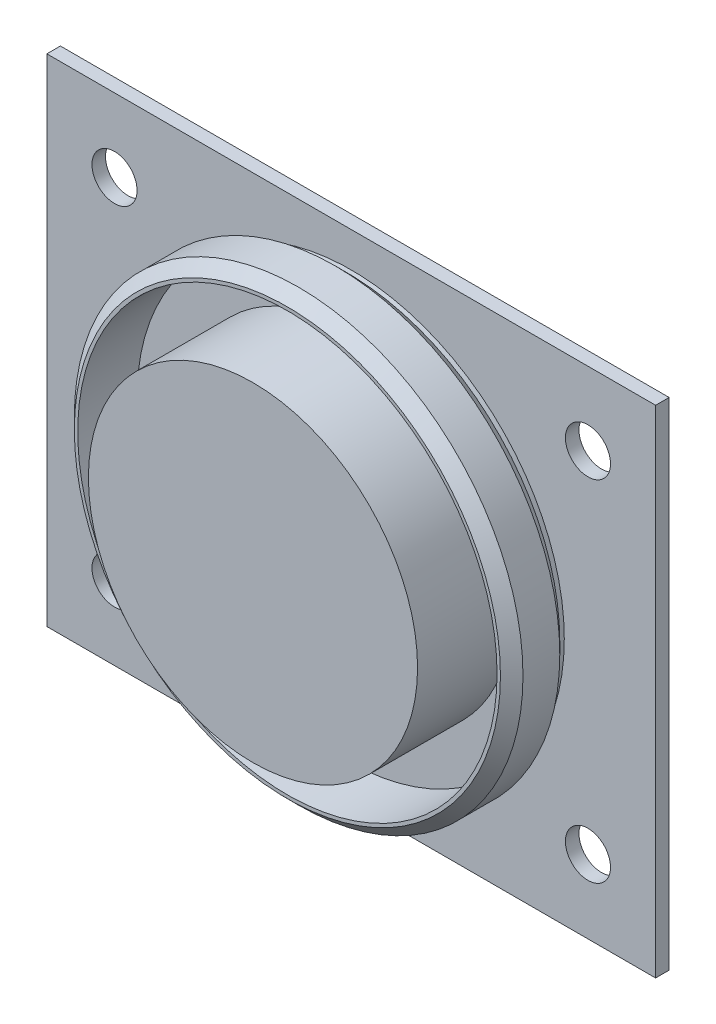
ISO-10303-21;
HEADER;
FILE_DESCRIPTION(('STEP AP214'),'2;1');
FILE_NAME('part.step','',(''),(''),'','','');
FILE_SCHEMA(('AUTOMOTIVE_DESIGN { 1 0 10303 214 1 1 1 1 }'));
ENDSEC;
DATA;
#1=APPLICATION_CONTEXT('core data for automotive mechanical design processes');
#2=APPLICATION_PROTOCOL_DEFINITION('international standard','automotive_design',2000,#1);
#3=PRODUCT_CONTEXT('',#1,'mechanical');
#4=PRODUCT('Part','Part','',(#3));
#5=PRODUCT_RELATED_PRODUCT_CATEGORY('part','',(#4));
#6=PRODUCT_DEFINITION_FORMATION('','',#4);
#7=PRODUCT_DEFINITION_CONTEXT('part definition',#1,'design');
#8=PRODUCT_DEFINITION('design','',#6,#7);
#9=PRODUCT_DEFINITION_SHAPE('','',#8);
#10=(LENGTH_UNIT() NAMED_UNIT(*) SI_UNIT(.MILLI.,.METRE.));
#11=(NAMED_UNIT(*) PLANE_ANGLE_UNIT() SI_UNIT($,.RADIAN.));
#12=(NAMED_UNIT(*) SI_UNIT($,.STERADIAN.) SOLID_ANGLE_UNIT());
#13=UNCERTAINTY_MEASURE_WITH_UNIT(LENGTH_MEASURE(1.E-05),#10,'distance_accuracy_value','');
#14=(GEOMETRIC_REPRESENTATION_CONTEXT(3) GLOBAL_UNCERTAINTY_ASSIGNED_CONTEXT((#13)) GLOBAL_UNIT_ASSIGNED_CONTEXT((#10,
#11,#12)) REPRESENTATION_CONTEXT('',''));
#15=CARTESIAN_POINT('',(0.,0.,0.));
#16=DIRECTION('',(0.,0.,1.));
#17=DIRECTION('',(1.,0.,0.));
#18=AXIS2_PLACEMENT_3D('',#15,#16,#17);
#19=CARTESIAN_POINT('',(0.,0.,3.));
#20=DIRECTION('',(0.,0.,1.));
#21=DIRECTION('',(1.,0.,0.));
#22=AXIS2_PLACEMENT_3D('',#19,#20,#21);
#23=PLANE('',#22);
#24=CARTESIAN_POINT('',(0.,0.,3.));
#25=DIRECTION('',(0.,0.,1.));
#26=DIRECTION('',(1.,0.,0.));
#27=AXIS2_PLACEMENT_3D('',#24,#25,#26);
#28=CIRCLE('',#27,47.25);
#29=CARTESIAN_POINT('',(47.25,0.,3.));
#30=VERTEX_POINT('',#29);
#31=EDGE_CURVE('E11',#30,#30,#28,.T.);
#32=ORIENTED_EDGE('',*,*,#31,.F.);
#33=EDGE_LOOP('',(#32));
#34=FACE_BOUND('',#33,.T.);
#35=CARTESIAN_POINT('',(52.5,-38.75,3.));
#36=DIRECTION('',(0.,0.,1.));
#37=DIRECTION('',(1.,0.,0.));
#38=AXIS2_PLACEMENT_3D('',#35,#36,#37);
#39=CIRCLE('',#38,5.00000000000001);
#40=CARTESIAN_POINT('',(57.5,-38.75,3.));
#41=VERTEX_POINT('',#40);
#42=EDGE_CURVE('E142',#41,#41,#39,.T.);
#43=ORIENTED_EDGE('',*,*,#42,.F.);
#44=EDGE_LOOP('',(#43));
#45=FACE_BOUND('',#44,.T.);
#46=CARTESIAN_POINT('',(-52.5,-38.75,3.));
#47=DIRECTION('',(0.,0.,1.));
#48=DIRECTION('',(1.,0.,0.));
#49=AXIS2_PLACEMENT_3D('',#46,#47,#48);
#50=CIRCLE('',#49,5.);
#51=CARTESIAN_POINT('',(-47.5,-38.75,3.));
#52=VERTEX_POINT('',#51);
#53=EDGE_CURVE('E105',#52,#52,#50,.T.);
#54=ORIENTED_EDGE('',*,*,#53,.F.);
#55=EDGE_LOOP('',(#54));
#56=FACE_BOUND('',#55,.T.);
#57=DIRECTION('',(0.,1.,0.));
#58=VECTOR('',#57,1.);
#59=CARTESIAN_POINT('',(67.5,55.,3.));
#60=LINE('',#59,#58);
#61=CARTESIAN_POINT('',(67.5,-55.,3.));
#62=VERTEX_POINT('',#61);
#63=CARTESIAN_POINT('',(67.5,55.,3.));
#64=VERTEX_POINT('',#63);
#65=EDGE_CURVE('E88',#62,#64,#60,.T.);
#66=ORIENTED_EDGE('',*,*,#65,.T.);
#67=DIRECTION('',(-1.,0.,0.));
#68=VECTOR('',#67,1.);
#69=CARTESIAN_POINT('',(-67.5,55.,3.));
#70=LINE('',#69,#68);
#71=CARTESIAN_POINT('',(-67.5,55.,3.));
#72=VERTEX_POINT('',#71);
#73=EDGE_CURVE('E83',#64,#72,#70,.T.);
#74=ORIENTED_EDGE('',*,*,#73,.T.);
#75=DIRECTION('',(0.,-1.,0.));
#76=VECTOR('',#75,1.);
#77=CARTESIAN_POINT('',(-67.5,55.,3.));
#78=LINE('',#77,#76);
#79=CARTESIAN_POINT('',(-67.5,-55.,3.));
#80=VERTEX_POINT('',#79);
#81=EDGE_CURVE('E86',#72,#80,#78,.T.);
#82=ORIENTED_EDGE('',*,*,#81,.T.);
#83=DIRECTION('',(1.,0.,0.));
#84=VECTOR('',#83,1.);
#85=CARTESIAN_POINT('',(-67.5,-55.,3.));
#86=LINE('',#85,#84);
#87=EDGE_CURVE('E52',#80,#62,#86,.T.);
#88=ORIENTED_EDGE('',*,*,#87,.T.);
#89=EDGE_LOOP('',(#66,#74,#82,#88));
#90=FACE_BOUND('',#89,.T.);
#91=CARTESIAN_POINT('',(-52.5,38.75,3.));
#92=DIRECTION('',(0.,0.,1.));
#93=DIRECTION('',(1.,0.,0.));
#94=AXIS2_PLACEMENT_3D('',#91,#92,#93);
#95=CIRCLE('',#94,5.);
#96=CARTESIAN_POINT('',(-47.5,38.75,3.));
#97=VERTEX_POINT('',#96);
#98=EDGE_CURVE('E146',#97,#97,#95,.T.);
#99=ORIENTED_EDGE('',*,*,#98,.F.);
#100=EDGE_LOOP('',(#99));
#101=FACE_BOUND('',#100,.T.);
#102=CARTESIAN_POINT('',(52.5,38.75,3.));
#103=DIRECTION('',(0.,0.,1.));
#104=DIRECTION('',(1.,0.,0.));
#105=AXIS2_PLACEMENT_3D('',#102,#103,#104);
#106=CIRCLE('',#105,5.00000000000001);
#107=CARTESIAN_POINT('',(57.5,38.75,3.));
#108=VERTEX_POINT('',#107);
#109=EDGE_CURVE('E133',#108,#108,#106,.T.);
#110=ORIENTED_EDGE('',*,*,#109,.F.);
#111=EDGE_LOOP('',(#110));
#112=FACE_BOUND('',#111,.T.);
#113=ADVANCED_FACE('F35',(#34,#45,#56,#90,#101,#112),#23,.T.);
#114=CARTESIAN_POINT('',(0.,0.,0.));
#115=DIRECTION('',(0.,0.,1.));
#116=DIRECTION('',(1.,0.,0.));
#117=AXIS2_PLACEMENT_3D('',#114,#115,#116);
#118=PLANE('',#117);
#119=DIRECTION('',(0.,1.,0.));
#120=VECTOR('',#119,1.);
#121=CARTESIAN_POINT('',(67.5,55.,0.));
#122=LINE('',#121,#120);
#123=CARTESIAN_POINT('',(67.5,-55.,0.));
#124=VERTEX_POINT('',#123);
#125=CARTESIAN_POINT('',(67.5,55.,0.));
#126=VERTEX_POINT('',#125);
#127=EDGE_CURVE('E102',#124,#126,#122,.T.);
#128=ORIENTED_EDGE('',*,*,#127,.F.);
#129=DIRECTION('',(1.,0.,0.));
#130=VECTOR('',#129,1.);
#131=CARTESIAN_POINT('',(-67.5,-55.,0.));
#132=LINE('',#131,#130);
#133=CARTESIAN_POINT('',(-67.5,-55.,0.));
#134=VERTEX_POINT('',#133);
#135=EDGE_CURVE('E75',#134,#124,#132,.T.);
#136=ORIENTED_EDGE('',*,*,#135,.F.);
#137=DIRECTION('',(0.,-1.,0.));
#138=VECTOR('',#137,1.);
#139=CARTESIAN_POINT('',(-67.5,55.,0.));
#140=LINE('',#139,#138);
#141=CARTESIAN_POINT('',(-67.5,55.,0.));
#142=VERTEX_POINT('',#141);
#143=EDGE_CURVE('E69',#142,#134,#140,.T.);
#144=ORIENTED_EDGE('',*,*,#143,.F.);
#145=DIRECTION('',(-1.,0.,0.));
#146=VECTOR('',#145,1.);
#147=CARTESIAN_POINT('',(-67.5,55.,0.));
#148=LINE('',#147,#146);
#149=EDGE_CURVE('E93',#126,#142,#148,.T.);
#150=ORIENTED_EDGE('',*,*,#149,.F.);
#151=EDGE_LOOP('',(#128,#136,#144,#150));
#152=FACE_BOUND('',#151,.T.);
#153=CARTESIAN_POINT('',(-52.5,-38.75,0.));
#154=DIRECTION('',(0.,0.,1.));
#155=DIRECTION('',(1.,0.,0.));
#156=AXIS2_PLACEMENT_3D('',#153,#154,#155);
#157=CIRCLE('',#156,5.);
#158=CARTESIAN_POINT('',(-47.5,-38.75,0.));
#159=VERTEX_POINT('',#158);
#160=EDGE_CURVE('E120',#159,#159,#157,.T.);
#161=ORIENTED_EDGE('',*,*,#160,.T.);
#162=EDGE_LOOP('',(#161));
#163=FACE_BOUND('',#162,.T.);
#164=CARTESIAN_POINT('',(-52.5,38.75,0.));
#165=DIRECTION('',(0.,0.,1.));
#166=DIRECTION('',(1.,0.,0.));
#167=AXIS2_PLACEMENT_3D('',#164,#165,#166);
#168=CIRCLE('',#167,5.);
#169=CARTESIAN_POINT('',(-47.5,38.75,0.));
#170=VERTEX_POINT('',#169);
#171=EDGE_CURVE('E124',#170,#170,#168,.T.);
#172=ORIENTED_EDGE('',*,*,#171,.T.);
#173=EDGE_LOOP('',(#172));
#174=FACE_BOUND('',#173,.T.);
#175=CARTESIAN_POINT('',(52.5,-38.75,0.));
#176=DIRECTION('',(0.,0.,1.));
#177=DIRECTION('',(1.,0.,0.));
#178=AXIS2_PLACEMENT_3D('',#175,#176,#177);
#179=CIRCLE('',#178,5.00000000000001);
#180=CARTESIAN_POINT('',(57.5,-38.75,0.));
#181=VERTEX_POINT('',#180);
#182=EDGE_CURVE('E128',#181,#181,#179,.T.);
#183=ORIENTED_EDGE('',*,*,#182,.T.);
#184=EDGE_LOOP('',(#183));
#185=FACE_BOUND('',#184,.T.);
#186=CARTESIAN_POINT('',(52.5,38.75,0.));
#187=DIRECTION('',(0.,0.,1.));
#188=DIRECTION('',(1.,0.,0.));
#189=AXIS2_PLACEMENT_3D('',#186,#187,#188);
#190=CIRCLE('',#189,5.00000000000001);
#191=CARTESIAN_POINT('',(57.5,38.75,0.));
#192=VERTEX_POINT('',#191);
#193=EDGE_CURVE('E131',#192,#192,#190,.T.);
#194=ORIENTED_EDGE('',*,*,#193,.T.);
#195=EDGE_LOOP('',(#194));
#196=FACE_BOUND('',#195,.T.);
#197=ADVANCED_FACE('F113',(#152,#163,#174,#185,#196),#118,.F.);
#198=CARTESIAN_POINT('',(67.5,55.,3.));
#199=DIRECTION('',(-1.,0.,0.));
#200=DIRECTION('',(0.,-1.,0.));
#201=AXIS2_PLACEMENT_3D('',#198,#199,#200);
#202=PLANE('',#201);
#203=ORIENTED_EDGE('',*,*,#127,.T.);
#204=DIRECTION('',(0.,0.,-1.));
#205=VECTOR('',#204,1.);
#206=CARTESIAN_POINT('',(67.5,55.,3.));
#207=LINE('',#206,#205);
#208=EDGE_CURVE('E44',#64,#126,#207,.T.);
#209=ORIENTED_EDGE('',*,*,#208,.F.);
#210=ORIENTED_EDGE('',*,*,#65,.F.);
#211=DIRECTION('',(0.,0.,-1.));
#212=VECTOR('',#211,1.);
#213=CARTESIAN_POINT('',(67.5,-55.,3.));
#214=LINE('',#213,#212);
#215=EDGE_CURVE('E98',#62,#124,#214,.T.);
#216=ORIENTED_EDGE('',*,*,#215,.T.);
#217=EDGE_LOOP('',(#203,#209,#210,#216));
#218=FACE_BOUND('',#217,.T.);
#219=ADVANCED_FACE('F37',(#218),#202,.F.);
#220=CARTESIAN_POINT('',(-67.5,55.,3.));
#221=DIRECTION('',(0.,-1.,0.));
#222=DIRECTION('',(0.,0.,-1.));
#223=AXIS2_PLACEMENT_3D('',#220,#221,#222);
#224=PLANE('',#223);
#225=ORIENTED_EDGE('',*,*,#149,.T.);
#226=DIRECTION('',(0.,0.,-1.));
#227=VECTOR('',#226,1.);
#228=CARTESIAN_POINT('',(-67.5,55.,3.));
#229=LINE('',#228,#227);
#230=EDGE_CURVE('E91',#72,#142,#229,.T.);
#231=ORIENTED_EDGE('',*,*,#230,.F.);
#232=ORIENTED_EDGE('',*,*,#73,.F.);
#233=ORIENTED_EDGE('',*,*,#208,.T.);
#234=EDGE_LOOP('',(#225,#231,#232,#233));
#235=FACE_BOUND('',#234,.T.);
#236=ADVANCED_FACE('F92',(#235),#224,.F.);
#237=CARTESIAN_POINT('',(-67.5,55.,3.));
#238=DIRECTION('',(1.,0.,0.));
#239=DIRECTION('',(0.,1.,0.));
#240=AXIS2_PLACEMENT_3D('',#237,#238,#239);
#241=PLANE('',#240);
#242=ORIENTED_EDGE('',*,*,#143,.T.);
#243=DIRECTION('',(0.,0.,-1.));
#244=VECTOR('',#243,1.);
#245=CARTESIAN_POINT('',(-67.5,-55.,3.));
#246=LINE('',#245,#244);
#247=EDGE_CURVE('E94',#80,#134,#246,.T.);
#248=ORIENTED_EDGE('',*,*,#247,.F.);
#249=ORIENTED_EDGE('',*,*,#81,.F.);
#250=ORIENTED_EDGE('',*,*,#230,.T.);
#251=EDGE_LOOP('',(#242,#248,#249,#250));
#252=FACE_BOUND('',#251,.T.);
#253=ADVANCED_FACE('F96',(#252),#241,.F.);
#254=CARTESIAN_POINT('',(-67.5,-55.,3.));
#255=DIRECTION('',(0.,1.,0.));
#256=DIRECTION('',(0.,0.,1.));
#257=AXIS2_PLACEMENT_3D('',#254,#255,#256);
#258=PLANE('',#257);
#259=ORIENTED_EDGE('',*,*,#135,.T.);
#260=ORIENTED_EDGE('',*,*,#215,.F.);
#261=ORIENTED_EDGE('',*,*,#87,.F.);
#262=ORIENTED_EDGE('',*,*,#247,.T.);
#263=EDGE_LOOP('',(#259,#260,#261,#262));
#264=FACE_BOUND('',#263,.T.);
#265=ADVANCED_FACE('F167',(#264),#258,.F.);
#266=CARTESIAN_POINT('',(-52.5,-38.75,3.));
#267=DIRECTION('',(0.,0.,-1.));
#268=DIRECTION('',(-1.,0.,0.));
#269=AXIS2_PLACEMENT_3D('',#266,#267,#268);
#270=CYLINDRICAL_SURFACE('',#269,5.);
#271=ORIENTED_EDGE('',*,*,#53,.T.);
#272=EDGE_LOOP('',(#271));
#273=FACE_BOUND('',#272,.T.);
#274=ORIENTED_EDGE('',*,*,#160,.F.);
#275=EDGE_LOOP('',(#274));
#276=FACE_BOUND('',#275,.T.);
#277=ADVANCED_FACE('F154',(#273,#276),#270,.F.);
#278=CARTESIAN_POINT('',(-52.5,38.75,3.));
#279=DIRECTION('',(0.,0.,-1.));
#280=DIRECTION('',(-1.,0.,0.));
#281=AXIS2_PLACEMENT_3D('',#278,#279,#280);
#282=CYLINDRICAL_SURFACE('',#281,5.);
#283=ORIENTED_EDGE('',*,*,#98,.T.);
#284=EDGE_LOOP('',(#283));
#285=FACE_BOUND('',#284,.T.);
#286=ORIENTED_EDGE('',*,*,#171,.F.);
#287=EDGE_LOOP('',(#286));
#288=FACE_BOUND('',#287,.T.);
#289=ADVANCED_FACE('F210',(#285,#288),#282,.F.);
#290=CARTESIAN_POINT('',(52.5,-38.75,3.));
#291=DIRECTION('',(0.,0.,-1.));
#292=DIRECTION('',(-1.,0.,0.));
#293=AXIS2_PLACEMENT_3D('',#290,#291,#292);
#294=CYLINDRICAL_SURFACE('',#293,5.00000000000001);
#295=ORIENTED_EDGE('',*,*,#42,.T.);
#296=EDGE_LOOP('',(#295));
#297=FACE_BOUND('',#296,.T.);
#298=ORIENTED_EDGE('',*,*,#182,.F.);
#299=EDGE_LOOP('',(#298));
#300=FACE_BOUND('',#299,.T.);
#301=ADVANCED_FACE('F217',(#297,#300),#294,.F.);
#302=CARTESIAN_POINT('',(52.5,38.75,3.));
#303=DIRECTION('',(0.,0.,-1.));
#304=DIRECTION('',(-1.,0.,0.));
#305=AXIS2_PLACEMENT_3D('',#302,#303,#304);
#306=CYLINDRICAL_SURFACE('',#305,5.00000000000001);
#307=ORIENTED_EDGE('',*,*,#109,.T.);
#308=EDGE_LOOP('',(#307));
#309=FACE_BOUND('',#308,.T.);
#310=ORIENTED_EDGE('',*,*,#193,.F.);
#311=EDGE_LOOP('',(#310));
#312=FACE_BOUND('',#311,.T.);
#313=ADVANCED_FACE('F225',(#309,#312),#306,.F.);
#314=CARTESIAN_POINT('',(0.,0.,24.79));
#315=DIRECTION('',(0.,0.,1.));
#316=DIRECTION('',(1.,0.,0.));
#317=AXIS2_PLACEMENT_3D('',#314,#315,#316);
#318=PLANE('',#317);
#319=CARTESIAN_POINT('',(0.,0.,24.79));
#320=DIRECTION('',(0.,0.,1.));
#321=DIRECTION('',(1.,0.,0.));
#322=AXIS2_PLACEMENT_3D('',#319,#320,#321);
#323=CIRCLE('',#322,36.5);
#324=CARTESIAN_POINT('',(36.5,0.,24.79));
#325=VERTEX_POINT('',#324);
#326=EDGE_CURVE('E134',#325,#325,#323,.T.);
#327=ORIENTED_EDGE('',*,*,#326,.T.);
#328=EDGE_LOOP('',(#327));
#329=FACE_BOUND('',#328,.T.);
#330=ADVANCED_FACE('F234',(#329),#318,.T.);
#331=CARTESIAN_POINT('',(0.,0.,4.));
#332=DIRECTION('',(0.,0.,1.));
#333=DIRECTION('',(1.,0.,0.));
#334=AXIS2_PLACEMENT_3D('',#331,#332,#333);
#335=CYLINDRICAL_SURFACE('',#334,36.5);
#336=CARTESIAN_POINT('',(0.,0.,4.));
#337=DIRECTION('',(0.,0.,1.));
#338=DIRECTION('',(1.,0.,0.));
#339=AXIS2_PLACEMENT_3D('',#336,#337,#338);
#340=CIRCLE('',#339,36.5);
#341=CARTESIAN_POINT('',(36.5,0.,4.));
#342=VERTEX_POINT('',#341);
#343=EDGE_CURVE('E139',#342,#342,#340,.T.);
#344=ORIENTED_EDGE('',*,*,#343,.T.);
#345=EDGE_LOOP('',(#344));
#346=FACE_BOUND('',#345,.T.);
#347=ORIENTED_EDGE('',*,*,#326,.F.);
#348=EDGE_LOOP('',(#347));
#349=FACE_BOUND('',#348,.T.);
#350=ADVANCED_FACE('F243',(#346,#349),#335,.T.);
#351=CARTESIAN_POINT('',(36.5,0.,4.));
#352=DIRECTION('',(0.,0.,1.));
#353=DIRECTION('',(1.,0.,0.));
#354=AXIS2_PLACEMENT_3D('',#351,#352,#353);
#355=PLANE('',#354);
#356=CARTESIAN_POINT('',(0.,0.,3.99999999999999));
#357=DIRECTION('',(0.,0.,1.));
#358=DIRECTION('',(1.,0.,0.));
#359=AXIS2_PLACEMENT_3D('',#356,#357,#358);
#360=CIRCLE('',#359,46.5);
#361=CARTESIAN_POINT('',(46.5,0.,4.));
#362=VERTEX_POINT('',#361);
#363=EDGE_CURVE('E350',#362,#362,#360,.T.);
#364=ORIENTED_EDGE('',*,*,#363,.T.);
#365=EDGE_LOOP('',(#364));
#366=FACE_BOUND('',#365,.T.);
#367=ORIENTED_EDGE('',*,*,#343,.F.);
#368=EDGE_LOOP('',(#367));
#369=FACE_BOUND('',#368,.T.);
#370=ADVANCED_FACE('F252',(#366,#369),#355,.T.);
#371=CARTESIAN_POINT('',(0.,0.,4.));
#372=DIRECTION('',(0.,0.,1.));
#373=DIRECTION('',(1.,0.,0.));
#374=AXIS2_PLACEMENT_3D('',#371,#372,#373);
#375=CYLINDRICAL_SURFACE('',#374,46.5);
#376=CARTESIAN_POINT('',(0.,0.,17.16));
#377=DIRECTION('',(0.,0.,1.));
#378=DIRECTION('',(1.,0.,0.));
#379=AXIS2_PLACEMENT_3D('',#376,#377,#378);
#380=CIRCLE('',#379,46.5);
#381=CARTESIAN_POINT('',(46.5,0.,17.16));
#382=VERTEX_POINT('',#381);
#383=EDGE_CURVE('E347',#382,#382,#380,.T.);
#384=ORIENTED_EDGE('',*,*,#383,.T.);
#385=EDGE_LOOP('',(#384));
#386=FACE_BOUND('',#385,.T.);
#387=ORIENTED_EDGE('',*,*,#363,.F.);
#388=EDGE_LOOP('',(#387));
#389=FACE_BOUND('',#388,.T.);
#390=ADVANCED_FACE('F261',(#386,#389),#375,.F.);
#391=CARTESIAN_POINT('',(47.25,0.,17.16));
#392=DIRECTION('',(0.,0.,1.));
#393=DIRECTION('',(1.,0.,0.));
#394=AXIS2_PLACEMENT_3D('',#391,#392,#393);
#395=PLANE('',#394);
#396=CARTESIAN_POINT('',(0.,0.,17.16));
#397=DIRECTION('',(0.,0.,1.));
#398=DIRECTION('',(1.,0.,0.));
#399=AXIS2_PLACEMENT_3D('',#396,#397,#398);
#400=CIRCLE('',#399,47.25);
#401=CARTESIAN_POINT('',(47.25,0.,17.16));
#402=VERTEX_POINT('',#401);
#403=EDGE_CURVE('E344',#402,#402,#400,.T.);
#404=ORIENTED_EDGE('',*,*,#403,.T.);
#405=EDGE_LOOP('',(#404));
#406=FACE_BOUND('',#405,.T.);
#407=ORIENTED_EDGE('',*,*,#383,.F.);
#408=EDGE_LOOP('',(#407));
#409=FACE_BOUND('',#408,.T.);
#410=ADVANCED_FACE('F270',(#406,#409),#395,.T.);
#411=CARTESIAN_POINT('',(0.,0.,17.16));
#412=DIRECTION('',(0.,0.,-1.));
#413=DIRECTION('',(-1.,0.,0.));
#414=AXIS2_PLACEMENT_3D('',#411,#412,#413);
#415=CONICAL_SURFACE('',#414,47.25,0.785398163397447);
#416=CARTESIAN_POINT('',(0.,0.,14.66));
#417=DIRECTION('',(0.,0.,1.));
#418=DIRECTION('',(1.,0.,0.));
#419=AXIS2_PLACEMENT_3D('',#416,#417,#418);
#420=CIRCLE('',#419,49.75);
#421=CARTESIAN_POINT('',(49.75,0.,14.66));
#422=VERTEX_POINT('',#421);
#423=EDGE_CURVE('E339',#422,#422,#420,.T.);
#424=ORIENTED_EDGE('',*,*,#423,.T.);
#425=EDGE_LOOP('',(#424));
#426=FACE_BOUND('',#425,.T.);
#427=ORIENTED_EDGE('',*,*,#403,.F.);
#428=EDGE_LOOP('',(#427));
#429=FACE_BOUND('',#428,.T.);
#430=ADVANCED_FACE('F279',(#426,#429),#415,.T.);
#431=CARTESIAN_POINT('',(0.,0.,4.));
#432=DIRECTION('',(0.,0.,1.));
#433=DIRECTION('',(1.,0.,0.));
#434=AXIS2_PLACEMENT_3D('',#431,#432,#433);
#435=CYLINDRICAL_SURFACE('',#434,49.75);
#436=CARTESIAN_POINT('',(0.,0.,6.4999999999999));
#437=DIRECTION('',(0.,0.,1.));
#438=DIRECTION('',(1.,0.,0.));
#439=AXIS2_PLACEMENT_3D('',#436,#437,#438);
#440=CIRCLE('',#439,49.75);
#441=CARTESIAN_POINT('',(49.75,0.,6.49999999999991));
#442=VERTEX_POINT('',#441);
#443=EDGE_CURVE('E336',#442,#442,#440,.T.);
#444=ORIENTED_EDGE('',*,*,#443,.T.);
#445=EDGE_LOOP('',(#444));
#446=FACE_BOUND('',#445,.T.);
#447=ORIENTED_EDGE('',*,*,#423,.F.);
#448=EDGE_LOOP('',(#447));
#449=FACE_BOUND('',#448,.T.);
#450=ADVANCED_FACE('F288',(#446,#449),#435,.T.);
#451=CARTESIAN_POINT('',(0.,0.,6.4999999999999));
#452=DIRECTION('',(0.,0.,1.));
#453=DIRECTION('',(1.,0.,0.));
#454=AXIS2_PLACEMENT_3D('',#451,#452,#453);
#455=CONICAL_SURFACE('',#454,49.75,0.785398163397468);
#456=CARTESIAN_POINT('',(0.,0.,3.99999999999999));
#457=DIRECTION('',(0.,0.,1.));
#458=DIRECTION('',(1.,0.,0.));
#459=AXIS2_PLACEMENT_3D('',#456,#457,#458);
#460=CIRCLE('',#459,47.25);
#461=CARTESIAN_POINT('',(47.25,0.,4.));
#462=VERTEX_POINT('',#461);
#463=EDGE_CURVE('E335',#462,#462,#460,.T.);
#464=ORIENTED_EDGE('',*,*,#463,.T.);
#465=EDGE_LOOP('',(#464));
#466=FACE_BOUND('',#465,.T.);
#467=ORIENTED_EDGE('',*,*,#443,.F.);
#468=EDGE_LOOP('',(#467));
#469=FACE_BOUND('',#468,.T.);
#470=ADVANCED_FACE('F297',(#466,#469),#455,.T.);
#471=CARTESIAN_POINT('',(0.,0.,4.));
#472=DIRECTION('',(0.,0.,1.));
#473=DIRECTION('',(1.,0.,0.));
#474=AXIS2_PLACEMENT_3D('',#471,#472,#473);
#475=CYLINDRICAL_SURFACE('',#474,47.25);
#476=ORIENTED_EDGE('',*,*,#31,.T.);
#477=EDGE_LOOP('',(#476));
#478=FACE_BOUND('',#477,.T.);
#479=ORIENTED_EDGE('',*,*,#463,.F.);
#480=EDGE_LOOP('',(#479));
#481=FACE_BOUND('',#480,.T.);
#482=ADVANCED_FACE('F306',(#478,#481),#475,.T.);
#483=CLOSED_SHELL('',(#113,#197,#219,#236,#253,#265,#277,#289,#301,#313,#330,#350,#370,#390,
#410,#430,#450,#470,#482));
#484=MANIFOLD_SOLID_BREP('B2',#483);
#485=ADVANCED_BREP_SHAPE_REPRESENTATION('',(#18,#484),#14);
#486=SHAPE_DEFINITION_REPRESENTATION(#9,#485);
ENDSEC;
END-ISO-10303-21;
